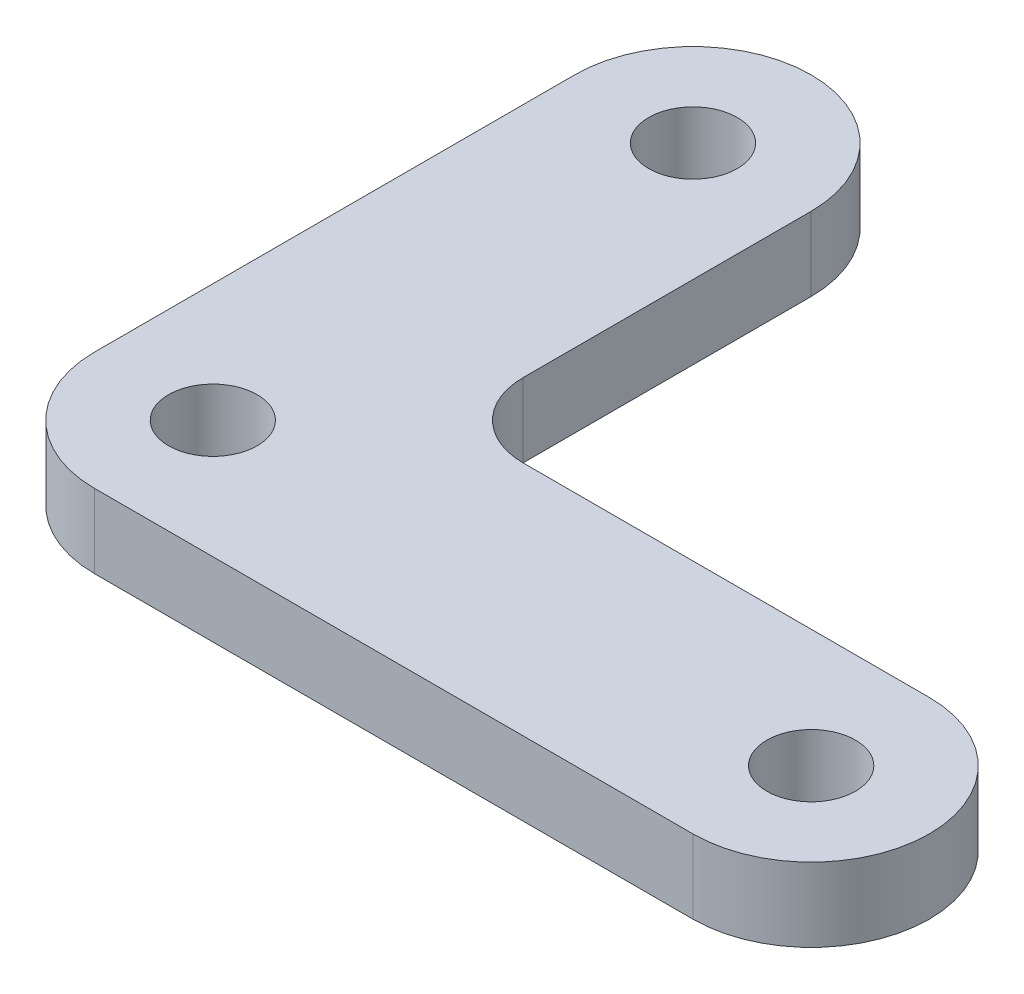
ISO-10303-21;
HEADER;
FILE_DESCRIPTION(('STEP AP214'),'2;1');
FILE_NAME('part.step','',(''),(''),'','','');
FILE_SCHEMA(('AUTOMOTIVE_DESIGN { 1 0 10303 214 1 1 1 1 }'));
ENDSEC;
DATA;
#1=APPLICATION_CONTEXT('core data for automotive mechanical design processes');
#2=APPLICATION_PROTOCOL_DEFINITION('international standard','automotive_design',2000,#1);
#3=PRODUCT_CONTEXT('',#1,'mechanical');
#4=PRODUCT('Part','Part','',(#3));
#5=PRODUCT_RELATED_PRODUCT_CATEGORY('part','',(#4));
#6=PRODUCT_DEFINITION_FORMATION('','',#4);
#7=PRODUCT_DEFINITION_CONTEXT('part definition',#1,'design');
#8=PRODUCT_DEFINITION('design','',#6,#7);
#9=PRODUCT_DEFINITION_SHAPE('','',#8);
#10=(LENGTH_UNIT() NAMED_UNIT(*) SI_UNIT(.MILLI.,.METRE.));
#11=(NAMED_UNIT(*) PLANE_ANGLE_UNIT() SI_UNIT($,.RADIAN.));
#12=(NAMED_UNIT(*) SI_UNIT($,.STERADIAN.) SOLID_ANGLE_UNIT());
#13=UNCERTAINTY_MEASURE_WITH_UNIT(LENGTH_MEASURE(1.E-05),#10,'distance_accuracy_value','');
#14=(GEOMETRIC_REPRESENTATION_CONTEXT(3) GLOBAL_UNCERTAINTY_ASSIGNED_CONTEXT((#13)) GLOBAL_UNIT_ASSIGNED_CONTEXT((#10,
#11,#12)) REPRESENTATION_CONTEXT('',''));
#15=CARTESIAN_POINT('',(0.,0.,0.));
#16=DIRECTION('',(0.,0.,1.));
#17=DIRECTION('',(1.,0.,0.));
#18=AXIS2_PLACEMENT_3D('',#15,#16,#17);
#19=CARTESIAN_POINT('',(0.,10.,-65.));
#20=DIRECTION('',(0.,1.,0.));
#21=DIRECTION('',(0.,0.,1.));
#22=AXIS2_PLACEMENT_3D('',#19,#20,#21);
#23=PLANE('',#22);
#24=CARTESIAN_POINT('',(81.,10.,0.));
#25=DIRECTION('',(0.,1.,0.));
#26=DIRECTION('',(0.,0.,1.));
#27=AXIS2_PLACEMENT_3D('',#24,#25,#26);
#28=CIRCLE('',#27,6.);
#29=CARTESIAN_POINT('',(81.,10.,6.));
#30=VERTEX_POINT('',#29);
#31=EDGE_CURVE('E186',#30,#30,#28,.T.);
#32=ORIENTED_EDGE('',*,*,#31,.F.);
#33=EDGE_LOOP('',(#32));
#34=FACE_BOUND('',#33,.T.);
#35=CARTESIAN_POINT('',(0.,10.,-65.));
#36=DIRECTION('',(0.,1.,0.));
#37=DIRECTION('',(0.,0.,1.));
#38=AXIS2_PLACEMENT_3D('',#35,#36,#37);
#39=CIRCLE('',#38,16.);
#40=CARTESIAN_POINT('',(16.,10.,-65.));
#41=VERTEX_POINT('',#40);
#42=CARTESIAN_POINT('',(-16.,10.,-65.));
#43=VERTEX_POINT('',#42);
#44=EDGE_CURVE('E149',#41,#43,#39,.T.);
#45=ORIENTED_EDGE('',*,*,#44,.T.);
#46=DIRECTION('',(0.,0.,1.));
#47=VECTOR('',#46,1.);
#48=CARTESIAN_POINT('',(-16.,10.,-65.));
#49=LINE('',#48,#47);
#50=CARTESIAN_POINT('',(-16.,10.,0.));
#51=VERTEX_POINT('',#50);
#52=EDGE_CURVE('E97',#43,#51,#49,.T.);
#53=ORIENTED_EDGE('',*,*,#52,.T.);
#54=CARTESIAN_POINT('',(0.,10.,0.));
#55=DIRECTION('',(0.,1.,0.));
#56=DIRECTION('',(0.,0.,1.));
#57=AXIS2_PLACEMENT_3D('',#54,#55,#56);
#58=CIRCLE('',#57,16.);
#59=CARTESIAN_POINT('',(0.,10.,16.));
#60=VERTEX_POINT('',#59);
#61=EDGE_CURVE('E164',#51,#60,#58,.T.);
#62=ORIENTED_EDGE('',*,*,#61,.T.);
#63=DIRECTION('',(1.,0.,0.));
#64=VECTOR('',#63,1.);
#65=CARTESIAN_POINT('',(0.,10.,16.));
#66=LINE('',#65,#64);
#67=CARTESIAN_POINT('',(81.,10.,16.));
#68=VERTEX_POINT('',#67);
#69=EDGE_CURVE('E177',#60,#68,#66,.T.);
#70=ORIENTED_EDGE('',*,*,#69,.T.);
#71=CARTESIAN_POINT('',(81.,10.,0.));
#72=DIRECTION('',(0.,1.,0.));
#73=DIRECTION('',(0.,0.,1.));
#74=AXIS2_PLACEMENT_3D('',#71,#72,#73);
#75=CIRCLE('',#74,16.);
#76=CARTESIAN_POINT('',(81.,10.,-16.));
#77=VERTEX_POINT('',#76);
#78=EDGE_CURVE('E116',#68,#77,#75,.T.);
#79=ORIENTED_EDGE('',*,*,#78,.T.);
#80=DIRECTION('',(-1.,0.,0.));
#81=VECTOR('',#80,1.);
#82=CARTESIAN_POINT('',(81.,10.,-16.));
#83=LINE('',#82,#81);
#84=CARTESIAN_POINT('',(26.0000000000001,10.,-16.));
#85=VERTEX_POINT('',#84);
#86=EDGE_CURVE('E110',#77,#85,#83,.T.);
#87=ORIENTED_EDGE('',*,*,#86,.T.);
#88=CARTESIAN_POINT('',(26.,10.,-26.));
#89=DIRECTION('',(0.,-1.,0.));
#90=DIRECTION('',(0.,0.,-1.));
#91=AXIS2_PLACEMENT_3D('',#88,#89,#90);
#92=CIRCLE('',#91,10.);
#93=CARTESIAN_POINT('',(16.,10.,-26.0000000000001));
#94=VERTEX_POINT('',#93);
#95=EDGE_CURVE('E114',#85,#94,#92,.T.);
#96=ORIENTED_EDGE('',*,*,#95,.T.);
#97=DIRECTION('',(0.,0.,-1.));
#98=VECTOR('',#97,1.);
#99=CARTESIAN_POINT('',(16.,10.,-26.0000000000001));
#100=LINE('',#99,#98);
#101=EDGE_CURVE('E54',#94,#41,#100,.T.);
#102=ORIENTED_EDGE('',*,*,#101,.T.);
#103=EDGE_LOOP('',(#45,#53,#62,#70,#79,#87,#96,#102));
#104=FACE_BOUND('',#103,.T.);
#105=CARTESIAN_POINT('',(0.,10.,0.));
#106=DIRECTION('',(0.,1.,0.));
#107=DIRECTION('',(0.,0.,1.));
#108=AXIS2_PLACEMENT_3D('',#105,#106,#107);
#109=CIRCLE('',#108,6.);
#110=CARTESIAN_POINT('',(0.,10.,6.));
#111=VERTEX_POINT('',#110);
#112=EDGE_CURVE('E138',#111,#111,#109,.T.);
#113=ORIENTED_EDGE('',*,*,#112,.F.);
#114=EDGE_LOOP('',(#113));
#115=FACE_BOUND('',#114,.T.);
#116=CARTESIAN_POINT('',(0.,10.,-65.));
#117=DIRECTION('',(0.,1.,0.));
#118=DIRECTION('',(0.,0.,1.));
#119=AXIS2_PLACEMENT_3D('',#116,#117,#118);
#120=CIRCLE('',#119,6.);
#121=CARTESIAN_POINT('',(0.,10.,-59.));
#122=VERTEX_POINT('',#121);
#123=EDGE_CURVE('E192',#122,#122,#120,.T.);
#124=ORIENTED_EDGE('',*,*,#123,.F.);
#125=EDGE_LOOP('',(#124));
#126=FACE_BOUND('',#125,.T.);
#127=ADVANCED_FACE('F37',(#34,#104,#115,#126),#23,.T.);
#128=CARTESIAN_POINT('',(0.,0.,-65.));
#129=DIRECTION('',(0.,1.,0.));
#130=DIRECTION('',(0.,0.,1.));
#131=AXIS2_PLACEMENT_3D('',#128,#129,#130);
#132=PLANE('',#131);
#133=CARTESIAN_POINT('',(0.,0.,-65.));
#134=DIRECTION('',(0.,1.,0.));
#135=DIRECTION('',(0.,0.,1.));
#136=AXIS2_PLACEMENT_3D('',#133,#134,#135);
#137=CIRCLE('',#136,16.);
#138=CARTESIAN_POINT('',(16.,0.,-65.));
#139=VERTEX_POINT('',#138);
#140=CARTESIAN_POINT('',(-16.,0.,-65.));
#141=VERTEX_POINT('',#140);
#142=EDGE_CURVE('E134',#139,#141,#137,.T.);
#143=ORIENTED_EDGE('',*,*,#142,.F.);
#144=DIRECTION('',(0.,0.,-1.));
#145=VECTOR('',#144,1.);
#146=CARTESIAN_POINT('',(16.,0.,-26.0000000000001));
#147=LINE('',#146,#145);
#148=CARTESIAN_POINT('',(16.,0.,-26.0000000000001));
#149=VERTEX_POINT('',#148);
#150=EDGE_CURVE('E89',#149,#139,#147,.T.);
#151=ORIENTED_EDGE('',*,*,#150,.F.);
#152=CARTESIAN_POINT('',(26.,0.,-26.));
#153=DIRECTION('',(0.,-1.,0.));
#154=DIRECTION('',(0.,0.,-1.));
#155=AXIS2_PLACEMENT_3D('',#152,#153,#154);
#156=CIRCLE('',#155,10.);
#157=CARTESIAN_POINT('',(26.0000000000001,0.,-16.));
#158=VERTEX_POINT('',#157);
#159=EDGE_CURVE('E83',#158,#149,#156,.T.);
#160=ORIENTED_EDGE('',*,*,#159,.F.);
#161=DIRECTION('',(-1.,0.,0.));
#162=VECTOR('',#161,1.);
#163=CARTESIAN_POINT('',(81.,0.,-16.));
#164=LINE('',#163,#162);
#165=CARTESIAN_POINT('',(81.,0.,-16.));
#166=VERTEX_POINT('',#165);
#167=EDGE_CURVE('E124',#166,#158,#164,.T.);
#168=ORIENTED_EDGE('',*,*,#167,.F.);
#169=CARTESIAN_POINT('',(81.,0.,0.));
#170=DIRECTION('',(0.,1.,0.));
#171=DIRECTION('',(0.,0.,1.));
#172=AXIS2_PLACEMENT_3D('',#169,#170,#171);
#173=CIRCLE('',#172,16.);
#174=CARTESIAN_POINT('',(81.,0.,16.));
#175=VERTEX_POINT('',#174);
#176=EDGE_CURVE('E144',#175,#166,#173,.T.);
#177=ORIENTED_EDGE('',*,*,#176,.F.);
#178=DIRECTION('',(1.,0.,0.));
#179=VECTOR('',#178,1.);
#180=CARTESIAN_POINT('',(0.,0.,16.));
#181=LINE('',#180,#179);
#182=CARTESIAN_POINT('',(0.,0.,16.));
#183=VERTEX_POINT('',#182);
#184=EDGE_CURVE('E142',#183,#175,#181,.T.);
#185=ORIENTED_EDGE('',*,*,#184,.F.);
#186=CARTESIAN_POINT('',(0.,0.,0.));
#187=DIRECTION('',(0.,1.,0.));
#188=DIRECTION('',(0.,0.,1.));
#189=AXIS2_PLACEMENT_3D('',#186,#187,#188);
#190=CIRCLE('',#189,16.);
#191=CARTESIAN_POINT('',(-16.,0.,0.));
#192=VERTEX_POINT('',#191);
#193=EDGE_CURVE('E140',#192,#183,#190,.T.);
#194=ORIENTED_EDGE('',*,*,#193,.F.);
#195=DIRECTION('',(0.,0.,1.));
#196=VECTOR('',#195,1.);
#197=CARTESIAN_POINT('',(-16.,0.,-65.));
#198=LINE('',#197,#196);
#199=EDGE_CURVE('E137',#141,#192,#198,.T.);
#200=ORIENTED_EDGE('',*,*,#199,.F.);
#201=EDGE_LOOP('',(#143,#151,#160,#168,#177,#185,#194,#200));
#202=FACE_BOUND('',#201,.T.);
#203=CARTESIAN_POINT('',(0.,0.,0.));
#204=DIRECTION('',(0.,1.,0.));
#205=DIRECTION('',(0.,0.,1.));
#206=AXIS2_PLACEMENT_3D('',#203,#204,#205);
#207=CIRCLE('',#206,6.);
#208=CARTESIAN_POINT('',(0.,0.,6.));
#209=VERTEX_POINT('',#208);
#210=EDGE_CURVE('E183',#209,#209,#207,.T.);
#211=ORIENTED_EDGE('',*,*,#210,.T.);
#212=EDGE_LOOP('',(#211));
#213=FACE_BOUND('',#212,.T.);
#214=CARTESIAN_POINT('',(81.,0.,0.));
#215=DIRECTION('',(0.,1.,0.));
#216=DIRECTION('',(0.,0.,1.));
#217=AXIS2_PLACEMENT_3D('',#214,#215,#216);
#218=CIRCLE('',#217,6.);
#219=CARTESIAN_POINT('',(81.,0.,6.));
#220=VERTEX_POINT('',#219);
#221=EDGE_CURVE('E189',#220,#220,#218,.T.);
#222=ORIENTED_EDGE('',*,*,#221,.T.);
#223=EDGE_LOOP('',(#222));
#224=FACE_BOUND('',#223,.T.);
#225=CARTESIAN_POINT('',(0.,0.,-65.));
#226=DIRECTION('',(0.,1.,0.));
#227=DIRECTION('',(0.,0.,1.));
#228=AXIS2_PLACEMENT_3D('',#225,#226,#227);
#229=CIRCLE('',#228,6.);
#230=CARTESIAN_POINT('',(0.,0.,-59.));
#231=VERTEX_POINT('',#230);
#232=EDGE_CURVE('E195',#231,#231,#229,.T.);
#233=ORIENTED_EDGE('',*,*,#232,.T.);
#234=EDGE_LOOP('',(#233));
#235=FACE_BOUND('',#234,.T.);
#236=ADVANCED_FACE('F168',(#202,#213,#224,#235),#132,.F.);
#237=CARTESIAN_POINT('',(0.,10.,-65.));
#238=DIRECTION('',(0.,-1.,0.));
#239=DIRECTION('',(0.,0.,-1.));
#240=AXIS2_PLACEMENT_3D('',#237,#238,#239);
#241=CYLINDRICAL_SURFACE('',#240,16.);
#242=ORIENTED_EDGE('',*,*,#142,.T.);
#243=DIRECTION('',(0.,-1.,0.));
#244=VECTOR('',#243,1.);
#245=CARTESIAN_POINT('',(-16.,10.,-65.));
#246=LINE('',#245,#244);
#247=EDGE_CURVE('E11',#43,#141,#246,.T.);
#248=ORIENTED_EDGE('',*,*,#247,.F.);
#249=ORIENTED_EDGE('',*,*,#44,.F.);
#250=DIRECTION('',(0.,-1.,0.));
#251=VECTOR('',#250,1.);
#252=CARTESIAN_POINT('',(16.,10.,-65.));
#253=LINE('',#252,#251);
#254=EDGE_CURVE('E130',#41,#139,#253,.T.);
#255=ORIENTED_EDGE('',*,*,#254,.T.);
#256=EDGE_LOOP('',(#242,#248,#249,#255));
#257=FACE_BOUND('',#256,.T.);
#258=ADVANCED_FACE('F39',(#257),#241,.T.);
#259=CARTESIAN_POINT('',(-16.,10.,-65.));
#260=DIRECTION('',(1.,0.,0.));
#261=DIRECTION('',(0.,0.,-1.));
#262=AXIS2_PLACEMENT_3D('',#259,#260,#261);
#263=PLANE('',#262);
#264=ORIENTED_EDGE('',*,*,#199,.T.);
#265=DIRECTION('',(0.,-1.,0.));
#266=VECTOR('',#265,1.);
#267=CARTESIAN_POINT('',(-16.,10.,0.));
#268=LINE('',#267,#266);
#269=EDGE_CURVE('E46',#51,#192,#268,.T.);
#270=ORIENTED_EDGE('',*,*,#269,.F.);
#271=ORIENTED_EDGE('',*,*,#52,.F.);
#272=ORIENTED_EDGE('',*,*,#247,.T.);
#273=EDGE_LOOP('',(#264,#270,#271,#272));
#274=FACE_BOUND('',#273,.T.);
#275=ADVANCED_FACE('F228',(#274),#263,.F.);
#276=CARTESIAN_POINT('',(0.,10.,0.));
#277=DIRECTION('',(0.,-1.,0.));
#278=DIRECTION('',(0.,0.,-1.));
#279=AXIS2_PLACEMENT_3D('',#276,#277,#278);
#280=CYLINDRICAL_SURFACE('',#279,16.);
#281=ORIENTED_EDGE('',*,*,#193,.T.);
#282=DIRECTION('',(0.,-1.,0.));
#283=VECTOR('',#282,1.);
#284=CARTESIAN_POINT('',(0.,10.,16.));
#285=LINE('',#284,#283);
#286=EDGE_CURVE('E156',#60,#183,#285,.T.);
#287=ORIENTED_EDGE('',*,*,#286,.F.);
#288=ORIENTED_EDGE('',*,*,#61,.F.);
#289=ORIENTED_EDGE('',*,*,#269,.T.);
#290=EDGE_LOOP('',(#281,#287,#288,#289));
#291=FACE_BOUND('',#290,.T.);
#292=ADVANCED_FACE('F162',(#291),#280,.T.);
#293=CARTESIAN_POINT('',(0.,10.,16.));
#294=DIRECTION('',(0.,0.,-1.));
#295=DIRECTION('',(-1.,0.,0.));
#296=AXIS2_PLACEMENT_3D('',#293,#294,#295);
#297=PLANE('',#296);
#298=ORIENTED_EDGE('',*,*,#184,.T.);
#299=DIRECTION('',(0.,-1.,0.));
#300=VECTOR('',#299,1.);
#301=CARTESIAN_POINT('',(81.,10.,16.));
#302=LINE('',#301,#300);
#303=EDGE_CURVE('E153',#68,#175,#302,.T.);
#304=ORIENTED_EDGE('',*,*,#303,.F.);
#305=ORIENTED_EDGE('',*,*,#69,.F.);
#306=ORIENTED_EDGE('',*,*,#286,.T.);
#307=EDGE_LOOP('',(#298,#304,#305,#306));
#308=FACE_BOUND('',#307,.T.);
#309=ADVANCED_FACE('F173',(#308),#297,.F.);
#310=CARTESIAN_POINT('',(81.,10.,0.));
#311=DIRECTION('',(0.,-1.,0.));
#312=DIRECTION('',(0.,0.,-1.));
#313=AXIS2_PLACEMENT_3D('',#310,#311,#312);
#314=CYLINDRICAL_SURFACE('',#313,16.);
#315=ORIENTED_EDGE('',*,*,#176,.T.);
#316=DIRECTION('',(0.,-1.,0.));
#317=VECTOR('',#316,1.);
#318=CARTESIAN_POINT('',(81.,10.,-16.));
#319=LINE('',#318,#317);
#320=EDGE_CURVE('E125',#77,#166,#319,.T.);
#321=ORIENTED_EDGE('',*,*,#320,.F.);
#322=ORIENTED_EDGE('',*,*,#78,.F.);
#323=ORIENTED_EDGE('',*,*,#303,.T.);
#324=EDGE_LOOP('',(#315,#321,#322,#323));
#325=FACE_BOUND('',#324,.T.);
#326=ADVANCED_FACE('F176',(#325),#314,.T.);
#327=CARTESIAN_POINT('',(81.,10.,-16.));
#328=DIRECTION('',(0.,0.,1.));
#329=DIRECTION('',(1.,0.,0.));
#330=AXIS2_PLACEMENT_3D('',#327,#328,#329);
#331=PLANE('',#330);
#332=ORIENTED_EDGE('',*,*,#167,.T.);
#333=DIRECTION('',(0.,-1.,0.));
#334=VECTOR('',#333,1.);
#335=CARTESIAN_POINT('',(26.0000000000001,10.,-16.));
#336=LINE('',#335,#334);
#337=EDGE_CURVE('E121',#85,#158,#336,.T.);
#338=ORIENTED_EDGE('',*,*,#337,.F.);
#339=ORIENTED_EDGE('',*,*,#86,.F.);
#340=ORIENTED_EDGE('',*,*,#320,.T.);
#341=EDGE_LOOP('',(#332,#338,#339,#340));
#342=FACE_BOUND('',#341,.T.);
#343=ADVANCED_FACE('F122',(#342),#331,.F.);
#344=CARTESIAN_POINT('',(26.,10.,-26.));
#345=DIRECTION('',(0.,-1.,0.));
#346=DIRECTION('',(0.,0.,-1.));
#347=AXIS2_PLACEMENT_3D('',#344,#345,#346);
#348=CYLINDRICAL_SURFACE('',#347,10.);
#349=ORIENTED_EDGE('',*,*,#159,.T.);
#350=DIRECTION('',(0.,-1.,0.));
#351=VECTOR('',#350,1.);
#352=CARTESIAN_POINT('',(16.,10.,-26.0000000000001));
#353=LINE('',#352,#351);
#354=EDGE_CURVE('E126',#94,#149,#353,.T.);
#355=ORIENTED_EDGE('',*,*,#354,.F.);
#356=ORIENTED_EDGE('',*,*,#95,.F.);
#357=ORIENTED_EDGE('',*,*,#337,.T.);
#358=EDGE_LOOP('',(#349,#355,#356,#357));
#359=FACE_BOUND('',#358,.T.);
#360=ADVANCED_FACE('F128',(#359),#348,.F.);
#361=CARTESIAN_POINT('',(16.,10.,-26.0000000000001));
#362=DIRECTION('',(-1.,0.,0.));
#363=DIRECTION('',(0.,0.,1.));
#364=AXIS2_PLACEMENT_3D('',#361,#362,#363);
#365=PLANE('',#364);
#366=ORIENTED_EDGE('',*,*,#150,.T.);
#367=ORIENTED_EDGE('',*,*,#254,.F.);
#368=ORIENTED_EDGE('',*,*,#101,.F.);
#369=ORIENTED_EDGE('',*,*,#354,.T.);
#370=EDGE_LOOP('',(#366,#367,#368,#369));
#371=FACE_BOUND('',#370,.T.);
#372=ADVANCED_FACE('F216',(#371),#365,.F.);
#373=CARTESIAN_POINT('',(0.,10.,0.));
#374=DIRECTION('',(0.,-1.,0.));
#375=DIRECTION('',(0.,0.,-1.));
#376=AXIS2_PLACEMENT_3D('',#373,#374,#375);
#377=CYLINDRICAL_SURFACE('',#376,6.);
#378=ORIENTED_EDGE('',*,*,#112,.T.);
#379=EDGE_LOOP('',(#378));
#380=FACE_BOUND('',#379,.T.);
#381=ORIENTED_EDGE('',*,*,#210,.F.);
#382=EDGE_LOOP('',(#381));
#383=FACE_BOUND('',#382,.T.);
#384=ADVANCED_FACE('F213',(#380,#383),#377,.F.);
#385=CARTESIAN_POINT('',(81.,10.,0.));
#386=DIRECTION('',(0.,-1.,0.));
#387=DIRECTION('',(0.,0.,-1.));
#388=AXIS2_PLACEMENT_3D('',#385,#386,#387);
#389=CYLINDRICAL_SURFACE('',#388,6.);
#390=ORIENTED_EDGE('',*,*,#31,.T.);
#391=EDGE_LOOP('',(#390));
#392=FACE_BOUND('',#391,.T.);
#393=ORIENTED_EDGE('',*,*,#221,.F.);
#394=EDGE_LOOP('',(#393));
#395=FACE_BOUND('',#394,.T.);
#396=ADVANCED_FACE('F292',(#392,#395),#389,.F.);
#397=CARTESIAN_POINT('',(0.,10.,-65.));
#398=DIRECTION('',(0.,-1.,0.));
#399=DIRECTION('',(0.,0.,-1.));
#400=AXIS2_PLACEMENT_3D('',#397,#398,#399);
#401=CYLINDRICAL_SURFACE('',#400,6.);
#402=ORIENTED_EDGE('',*,*,#123,.T.);
#403=EDGE_LOOP('',(#402));
#404=FACE_BOUND('',#403,.T.);
#405=ORIENTED_EDGE('',*,*,#232,.F.);
#406=EDGE_LOOP('',(#405));
#407=FACE_BOUND('',#406,.T.);
#408=ADVANCED_FACE('F201',(#404,#407),#401,.F.);
#409=CLOSED_SHELL('',(#127,#236,#258,#275,#292,#309,#326,#343,#360,#372,#384,#396,#408));
#410=MANIFOLD_SOLID_BREP('B2',#409);
#411=ADVANCED_BREP_SHAPE_REPRESENTATION('',(#18,#410),#14);
#412=SHAPE_DEFINITION_REPRESENTATION(#9,#411);
ENDSEC;
END-ISO-10303-21;
